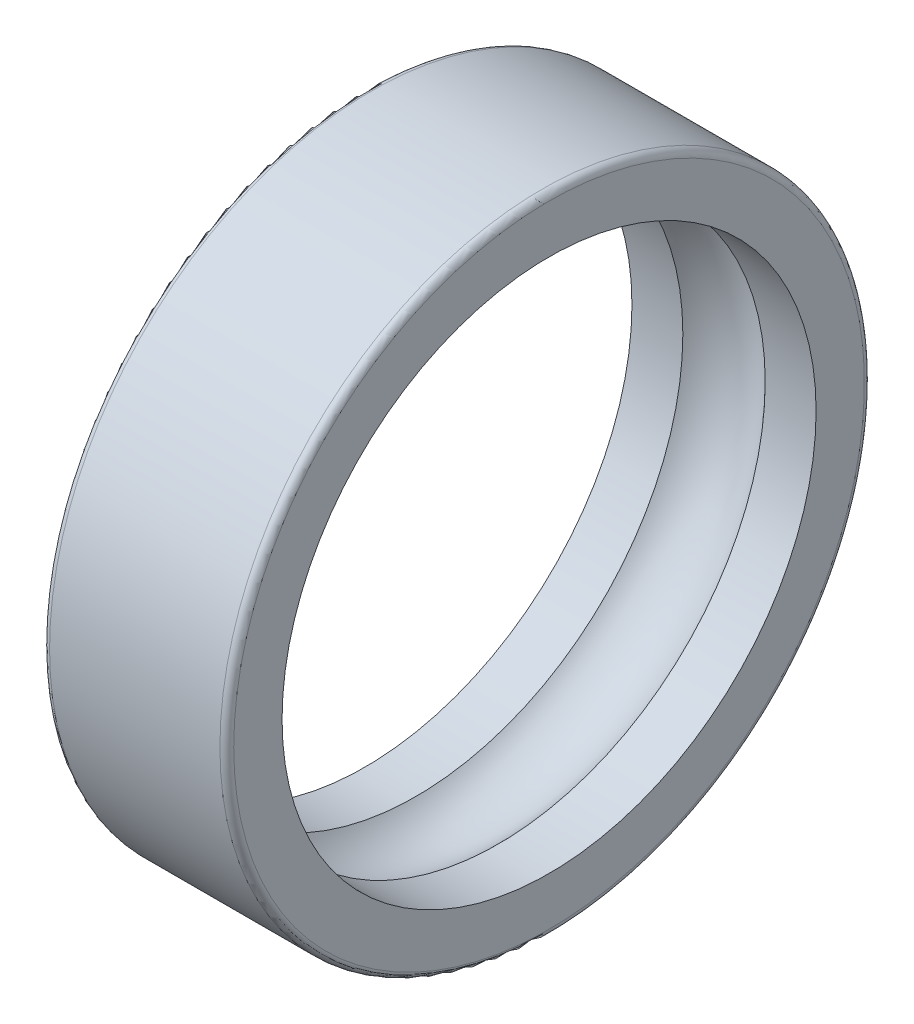
ISO-10303-21;
HEADER;
FILE_DESCRIPTION(('STEP AP214'),'2;1');
FILE_NAME('part.step','',(''),(''),'','','');
FILE_SCHEMA(('AUTOMOTIVE_DESIGN { 1 0 10303 214 1 1 1 1 }'));
ENDSEC;
DATA;
#1=APPLICATION_CONTEXT('core data for automotive mechanical design processes');
#2=APPLICATION_PROTOCOL_DEFINITION('international standard','automotive_design',2000,#1);
#3=PRODUCT_CONTEXT('',#1,'mechanical');
#4=PRODUCT('Part','Part','',(#3));
#5=PRODUCT_RELATED_PRODUCT_CATEGORY('part','',(#4));
#6=PRODUCT_DEFINITION_FORMATION('','',#4);
#7=PRODUCT_DEFINITION_CONTEXT('part definition',#1,'design');
#8=PRODUCT_DEFINITION('design','',#6,#7);
#9=PRODUCT_DEFINITION_SHAPE('','',#8);
#10=(LENGTH_UNIT() NAMED_UNIT(*) SI_UNIT(.MILLI.,.METRE.));
#11=(NAMED_UNIT(*) PLANE_ANGLE_UNIT() SI_UNIT($,.RADIAN.));
#12=(NAMED_UNIT(*) SI_UNIT($,.STERADIAN.) SOLID_ANGLE_UNIT());
#13=UNCERTAINTY_MEASURE_WITH_UNIT(LENGTH_MEASURE(1.E-05),#10,'distance_accuracy_value','');
#14=(GEOMETRIC_REPRESENTATION_CONTEXT(3) GLOBAL_UNCERTAINTY_ASSIGNED_CONTEXT((#13)) GLOBAL_UNIT_ASSIGNED_CONTEXT((#10,
#11,#12)) REPRESENTATION_CONTEXT('',''));
#15=CARTESIAN_POINT('',(0.,0.,0.));
#16=DIRECTION('',(0.,0.,1.));
#17=DIRECTION('',(1.,0.,0.));
#18=AXIS2_PLACEMENT_3D('',#15,#16,#17);
#19=CARTESIAN_POINT('',(0.300000000000001,0.,0.));
#20=DIRECTION('',(-1.,0.,0.));
#21=DIRECTION('',(0.,0.,1.));
#22=AXIS2_PLACEMENT_3D('',#19,#20,#21);
#23=TOROIDAL_SURFACE('',#22,13.7,0.299999999999999);
#24=CARTESIAN_POINT('',(0.,0.,0.));
#25=DIRECTION('',(-1.,0.,0.));
#26=DIRECTION('',(0.,0.,1.));
#27=AXIS2_PLACEMENT_3D('',#24,#25,#26);
#28=CIRCLE('',#27,13.7);
#29=CARTESIAN_POINT('',(0.,0.,13.7));
#30=VERTEX_POINT('',#29);
#31=EDGE_CURVE('E10',#30,#30,#28,.T.);
#32=ORIENTED_EDGE('',*,*,#31,.F.);
#33=EDGE_LOOP('',(#32));
#34=FACE_BOUND('',#33,.T.);
#35=CARTESIAN_POINT('',(0.300000000000001,0.,0.));
#36=DIRECTION('',(-1.,0.,0.));
#37=DIRECTION('',(0.,0.,1.));
#38=AXIS2_PLACEMENT_3D('',#35,#36,#37);
#39=CIRCLE('',#38,14.);
#40=CARTESIAN_POINT('',(0.300000000000001,0.,14.));
#41=VERTEX_POINT('',#40);
#42=EDGE_CURVE('E57',#41,#41,#39,.T.);
#43=ORIENTED_EDGE('',*,*,#42,.T.);
#44=EDGE_LOOP('',(#43));
#45=FACE_BOUND('',#44,.T.);
#46=ADVANCED_FACE('F29',(#34,#45),#23,.T.);
#47=CARTESIAN_POINT('',(0.,0.,-13.7));
#48=DIRECTION('',(1.,0.,0.));
#49=DIRECTION('',(0.,0.,-1.));
#50=AXIS2_PLACEMENT_3D('',#47,#48,#49);
#51=PLANE('',#50);
#52=CARTESIAN_POINT('',(0.,0.,0.));
#53=DIRECTION('',(-1.,0.,0.));
#54=DIRECTION('',(0.,0.,1.));
#55=AXIS2_PLACEMENT_3D('',#52,#53,#54);
#56=CIRCLE('',#55,11.6);
#57=CARTESIAN_POINT('',(0.,0.,11.6));
#58=VERTEX_POINT('',#57);
#59=EDGE_CURVE('E35',#58,#58,#56,.T.);
#60=ORIENTED_EDGE('',*,*,#59,.F.);
#61=EDGE_LOOP('',(#60));
#62=FACE_BOUND('',#61,.T.);
#63=ORIENTED_EDGE('',*,*,#31,.T.);
#64=EDGE_LOOP('',(#63));
#65=FACE_BOUND('',#64,.T.);
#66=ADVANCED_FACE('F94',(#62,#65),#51,.F.);
#67=CARTESIAN_POINT('',(0.,0.,0.));
#68=DIRECTION('',(-1.,0.,0.));
#69=DIRECTION('',(0.,0.,1.));
#70=AXIS2_PLACEMENT_3D('',#67,#68,#69);
#71=CYLINDRICAL_SURFACE('',#70,11.6);
#72=CARTESIAN_POINT('',(2.21114561800017,0.,0.));
#73=DIRECTION('',(-1.,0.,0.));
#74=DIRECTION('',(0.,0.,1.));
#75=AXIS2_PLACEMENT_3D('',#72,#73,#74);
#76=CIRCLE('',#75,11.6);
#77=CARTESIAN_POINT('',(2.21114561800017,0.,11.6));
#78=VERTEX_POINT('',#77);
#79=EDGE_CURVE('E39',#78,#78,#76,.T.);
#80=ORIENTED_EDGE('',*,*,#79,.F.);
#81=EDGE_LOOP('',(#80));
#82=FACE_BOUND('',#81,.T.);
#83=ORIENTED_EDGE('',*,*,#59,.T.);
#84=EDGE_LOOP('',(#83));
#85=FACE_BOUND('',#84,.T.);
#86=ADVANCED_FACE('F89',(#82,#85),#71,.F.);
#87=CARTESIAN_POINT('',(4.,0.,0.));
#88=DIRECTION('',(-1.,0.,0.));
#89=DIRECTION('',(0.,0.,1.));
#90=AXIS2_PLACEMENT_3D('',#87,#88,#89);
#91=TOROIDAL_SURFACE('',#90,10.,2.4);
#92=CARTESIAN_POINT('',(5.78885438199983,0.,0.));
#93=DIRECTION('',(-1.,0.,0.));
#94=DIRECTION('',(0.,0.,1.));
#95=AXIS2_PLACEMENT_3D('',#92,#93,#94);
#96=CIRCLE('',#95,11.6);
#97=CARTESIAN_POINT('',(5.78885438199983,0.,11.6));
#98=VERTEX_POINT('',#97);
#99=EDGE_CURVE('E43',#98,#98,#96,.T.);
#100=ORIENTED_EDGE('',*,*,#99,.F.);
#101=EDGE_LOOP('',(#100));
#102=FACE_BOUND('',#101,.T.);
#103=ORIENTED_EDGE('',*,*,#79,.T.);
#104=EDGE_LOOP('',(#103));
#105=FACE_BOUND('',#104,.T.);
#106=ADVANCED_FACE('F83',(#102,#105),#91,.F.);
#107=CARTESIAN_POINT('',(0.,0.,0.));
#108=DIRECTION('',(-1.,0.,0.));
#109=DIRECTION('',(0.,0.,1.));
#110=AXIS2_PLACEMENT_3D('',#107,#108,#109);
#111=CYLINDRICAL_SURFACE('',#110,11.6);
#112=CARTESIAN_POINT('',(8.,0.,0.));
#113=DIRECTION('',(-1.,0.,0.));
#114=DIRECTION('',(0.,0.,1.));
#115=AXIS2_PLACEMENT_3D('',#112,#113,#114);
#116=CIRCLE('',#115,11.6);
#117=CARTESIAN_POINT('',(8.,0.,11.6));
#118=VERTEX_POINT('',#117);
#119=EDGE_CURVE('E48',#118,#118,#116,.T.);
#120=ORIENTED_EDGE('',*,*,#119,.F.);
#121=EDGE_LOOP('',(#120));
#122=FACE_BOUND('',#121,.T.);
#123=ORIENTED_EDGE('',*,*,#99,.T.);
#124=EDGE_LOOP('',(#123));
#125=FACE_BOUND('',#124,.T.);
#126=ADVANCED_FACE('F77',(#122,#125),#111,.F.);
#127=CARTESIAN_POINT('',(8.,0.,-13.7));
#128=DIRECTION('',(-1.,0.,0.));
#129=DIRECTION('',(0.,0.,1.));
#130=AXIS2_PLACEMENT_3D('',#127,#128,#129);
#131=PLANE('',#130);
#132=CARTESIAN_POINT('',(8.,0.,0.));
#133=DIRECTION('',(-1.,0.,0.));
#134=DIRECTION('',(0.,0.,1.));
#135=AXIS2_PLACEMENT_3D('',#132,#133,#134);
#136=CIRCLE('',#135,13.7);
#137=CARTESIAN_POINT('',(8.,0.,13.7));
#138=VERTEX_POINT('',#137);
#139=EDGE_CURVE('E51',#138,#138,#136,.T.);
#140=ORIENTED_EDGE('',*,*,#139,.F.);
#141=EDGE_LOOP('',(#140));
#142=FACE_BOUND('',#141,.T.);
#143=ORIENTED_EDGE('',*,*,#119,.T.);
#144=EDGE_LOOP('',(#143));
#145=FACE_BOUND('',#144,.T.);
#146=ADVANCED_FACE('F71',(#142,#145),#131,.F.);
#147=CARTESIAN_POINT('',(7.7,0.,0.));
#148=DIRECTION('',(-1.,0.,0.));
#149=DIRECTION('',(0.,0.,1.));
#150=AXIS2_PLACEMENT_3D('',#147,#148,#149);
#151=TOROIDAL_SURFACE('',#150,13.7,0.299999999999999);
#152=CARTESIAN_POINT('',(7.7,0.,0.));
#153=DIRECTION('',(-1.,0.,0.));
#154=DIRECTION('',(0.,0.,1.));
#155=AXIS2_PLACEMENT_3D('',#152,#153,#154);
#156=CIRCLE('',#155,14.);
#157=CARTESIAN_POINT('',(7.7,0.,14.));
#158=VERTEX_POINT('',#157);
#159=EDGE_CURVE('E54',#158,#158,#156,.T.);
#160=ORIENTED_EDGE('',*,*,#159,.F.);
#161=EDGE_LOOP('',(#160));
#162=FACE_BOUND('',#161,.T.);
#163=ORIENTED_EDGE('',*,*,#139,.T.);
#164=EDGE_LOOP('',(#163));
#165=FACE_BOUND('',#164,.T.);
#166=ADVANCED_FACE('F65',(#162,#165),#151,.T.);
#167=CARTESIAN_POINT('',(0.,0.,0.));
#168=DIRECTION('',(-1.,0.,0.));
#169=DIRECTION('',(0.,0.,1.));
#170=AXIS2_PLACEMENT_3D('',#167,#168,#169);
#171=CYLINDRICAL_SURFACE('',#170,14.);
#172=ORIENTED_EDGE('',*,*,#42,.F.);
#173=EDGE_LOOP('',(#172));
#174=FACE_BOUND('',#173,.T.);
#175=ORIENTED_EDGE('',*,*,#159,.T.);
#176=EDGE_LOOP('',(#175));
#177=FACE_BOUND('',#176,.T.);
#178=ADVANCED_FACE('F62',(#174,#177),#171,.T.);
#179=CLOSED_SHELL('',(#46,#66,#86,#106,#126,#146,#166,#178));
#180=MANIFOLD_SOLID_BREP('B2',#179);
#181=ADVANCED_BREP_SHAPE_REPRESENTATION('',(#18,#180),#14);
#182=SHAPE_DEFINITION_REPRESENTATION(#9,#181);
ENDSEC;
END-ISO-10303-21;
